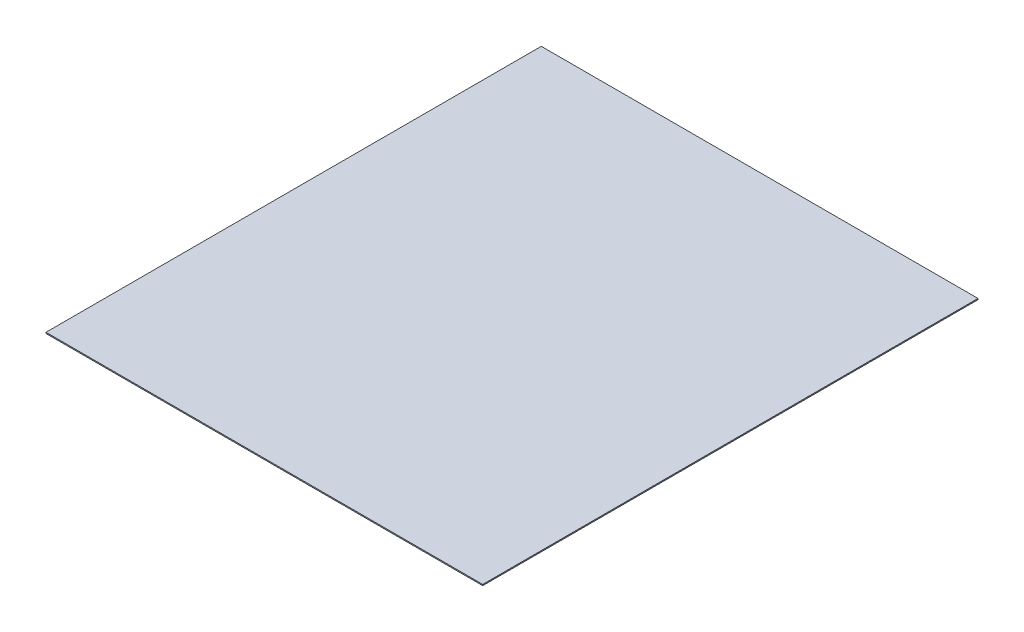
ISO-10303-21;
HEADER;
FILE_DESCRIPTION(('STEP AP214'),'2;1');
FILE_NAME('part.step','',(''),(''),'','','');
FILE_SCHEMA(('AUTOMOTIVE_DESIGN { 1 0 10303 214 1 1 1 1 }'));
ENDSEC;
DATA;
#1=APPLICATION_CONTEXT('core data for automotive mechanical design processes');
#2=APPLICATION_PROTOCOL_DEFINITION('international standard','automotive_design',2000,#1);
#3=PRODUCT_CONTEXT('',#1,'mechanical');
#4=PRODUCT('Part','Part','',(#3));
#5=PRODUCT_RELATED_PRODUCT_CATEGORY('part','',(#4));
#6=PRODUCT_DEFINITION_FORMATION('','',#4);
#7=PRODUCT_DEFINITION_CONTEXT('part definition',#1,'design');
#8=PRODUCT_DEFINITION('design','',#6,#7);
#9=PRODUCT_DEFINITION_SHAPE('','',#8);
#10=(LENGTH_UNIT() NAMED_UNIT(*) SI_UNIT(.MILLI.,.METRE.));
#11=(NAMED_UNIT(*) PLANE_ANGLE_UNIT() SI_UNIT($,.RADIAN.));
#12=(NAMED_UNIT(*) SI_UNIT($,.STERADIAN.) SOLID_ANGLE_UNIT());
#13=UNCERTAINTY_MEASURE_WITH_UNIT(LENGTH_MEASURE(1.E-05),#10,'distance_accuracy_value','');
#14=(GEOMETRIC_REPRESENTATION_CONTEXT(3) GLOBAL_UNCERTAINTY_ASSIGNED_CONTEXT((#13)) GLOBAL_UNIT_ASSIGNED_CONTEXT((#10,
#11,#12)) REPRESENTATION_CONTEXT('',''));
#15=CARTESIAN_POINT('',(0.,0.,0.));
#16=DIRECTION('',(0.,0.,1.));
#17=DIRECTION('',(1.,0.,0.));
#18=AXIS2_PLACEMENT_3D('',#15,#16,#17);
#19=CARTESIAN_POINT('',(16.7,5.,-666.));
#20=DIRECTION('',(-1.,0.,0.));
#21=DIRECTION('',(0.,0.,1.));
#22=AXIS2_PLACEMENT_3D('',#19,#20,#21);
#23=PLANE('',#22);
#24=DIRECTION('',(0.,-1.,0.));
#25=VECTOR('',#24,1.);
#26=CARTESIAN_POINT('',(16.7,5.,-3.));
#27=LINE('',#26,#25);
#28=CARTESIAN_POINT('',(16.7,6.5,-3.));
#29=VERTEX_POINT('',#28);
#30=CARTESIAN_POINT('',(16.7,5.,-3.));
#31=VERTEX_POINT('',#30);
#32=EDGE_CURVE('E103',#29,#31,#27,.T.);
#33=ORIENTED_EDGE('',*,*,#32,.F.);
#34=DIRECTION('',(0.,0.,1.));
#35=VECTOR('',#34,1.);
#36=CARTESIAN_POINT('',(16.7,6.5,-666.));
#37=LINE('',#36,#35);
#38=CARTESIAN_POINT('',(16.7,6.5,-666.));
#39=VERTEX_POINT('',#38);
#40=EDGE_CURVE('E11',#39,#29,#37,.T.);
#41=ORIENTED_EDGE('',*,*,#40,.F.);
#42=DIRECTION('',(0.,-1.,0.));
#43=VECTOR('',#42,1.);
#44=CARTESIAN_POINT('',(16.7,5.,-666.));
#45=LINE('',#44,#43);
#46=CARTESIAN_POINT('',(16.7,5.,-666.));
#47=VERTEX_POINT('',#46);
#48=EDGE_CURVE('E97',#39,#47,#45,.T.);
#49=ORIENTED_EDGE('',*,*,#48,.T.);
#50=DIRECTION('',(0.,0.,1.));
#51=VECTOR('',#50,1.);
#52=CARTESIAN_POINT('',(16.7,5.,-666.));
#53=LINE('',#52,#51);
#54=EDGE_CURVE('E42',#47,#31,#53,.T.);
#55=ORIENTED_EDGE('',*,*,#54,.T.);
#56=EDGE_LOOP('',(#33,#41,#49,#55));
#57=FACE_BOUND('',#56,.T.);
#58=ADVANCED_FACE('F39',(#57),#23,.T.);
#59=CARTESIAN_POINT('',(16.7,6.5,-666.));
#60=DIRECTION('',(0.,1.,0.));
#61=DIRECTION('',(0.,0.,1.));
#62=AXIS2_PLACEMENT_3D('',#59,#60,#61);
#63=PLANE('',#62);
#64=DIRECTION('',(-1.,0.,0.));
#65=VECTOR('',#64,1.);
#66=CARTESIAN_POINT('',(16.7,6.5,-3.));
#67=LINE('',#66,#65);
#68=CARTESIAN_POINT('',(601.3,6.5,-3.));
#69=VERTEX_POINT('',#68);
#70=EDGE_CURVE('E99',#69,#29,#67,.T.);
#71=ORIENTED_EDGE('',*,*,#70,.F.);
#72=DIRECTION('',(0.,0.,1.));
#73=VECTOR('',#72,1.);
#74=CARTESIAN_POINT('',(601.3,6.5,-666.));
#75=LINE('',#74,#73);
#76=CARTESIAN_POINT('',(601.3,6.5,-666.));
#77=VERTEX_POINT('',#76);
#78=EDGE_CURVE('E48',#77,#69,#75,.T.);
#79=ORIENTED_EDGE('',*,*,#78,.F.);
#80=DIRECTION('',(-1.,0.,0.));
#81=VECTOR('',#80,1.);
#82=CARTESIAN_POINT('',(16.7,6.5,-666.));
#83=LINE('',#82,#81);
#84=EDGE_CURVE('E94',#77,#39,#83,.T.);
#85=ORIENTED_EDGE('',*,*,#84,.T.);
#86=ORIENTED_EDGE('',*,*,#40,.T.);
#87=EDGE_LOOP('',(#71,#79,#85,#86));
#88=FACE_BOUND('',#87,.T.);
#89=ADVANCED_FACE('F113',(#88),#63,.T.);
#90=CARTESIAN_POINT('',(601.3,5.,-666.));
#91=DIRECTION('',(1.,0.,0.));
#92=DIRECTION('',(0.,0.,-1.));
#93=AXIS2_PLACEMENT_3D('',#90,#91,#92);
#94=PLANE('',#93);
#95=DIRECTION('',(0.,1.,0.));
#96=VECTOR('',#95,1.);
#97=CARTESIAN_POINT('',(601.3,5.,-3.));
#98=LINE('',#97,#96);
#99=CARTESIAN_POINT('',(601.3,5.,-3.));
#100=VERTEX_POINT('',#99);
#101=EDGE_CURVE('E89',#100,#69,#98,.T.);
#102=ORIENTED_EDGE('',*,*,#101,.F.);
#103=DIRECTION('',(0.,0.,1.));
#104=VECTOR('',#103,1.);
#105=CARTESIAN_POINT('',(601.3,5.,-666.));
#106=LINE('',#105,#104);
#107=CARTESIAN_POINT('',(601.3,5.,-666.));
#108=VERTEX_POINT('',#107);
#109=EDGE_CURVE('E84',#108,#100,#106,.T.);
#110=ORIENTED_EDGE('',*,*,#109,.F.);
#111=DIRECTION('',(0.,1.,0.));
#112=VECTOR('',#111,1.);
#113=CARTESIAN_POINT('',(601.3,5.,-666.));
#114=LINE('',#113,#112);
#115=EDGE_CURVE('E87',#108,#77,#114,.T.);
#116=ORIENTED_EDGE('',*,*,#115,.T.);
#117=ORIENTED_EDGE('',*,*,#78,.T.);
#118=EDGE_LOOP('',(#102,#110,#116,#117));
#119=FACE_BOUND('',#118,.T.);
#120=ADVANCED_FACE('F86',(#119),#94,.T.);
#121=CARTESIAN_POINT('',(16.7,5.,-666.));
#122=DIRECTION('',(0.,-1.,0.));
#123=DIRECTION('',(0.,0.,-1.));
#124=AXIS2_PLACEMENT_3D('',#121,#122,#123);
#125=PLANE('',#124);
#126=DIRECTION('',(1.,0.,0.));
#127=VECTOR('',#126,1.);
#128=CARTESIAN_POINT('',(16.7,5.,-3.));
#129=LINE('',#128,#127);
#130=EDGE_CURVE('E106',#31,#100,#129,.T.);
#131=ORIENTED_EDGE('',*,*,#130,.F.);
#132=ORIENTED_EDGE('',*,*,#54,.F.);
#133=DIRECTION('',(1.,0.,0.));
#134=VECTOR('',#133,1.);
#135=CARTESIAN_POINT('',(16.7,5.,-666.));
#136=LINE('',#135,#134);
#137=EDGE_CURVE('E93',#47,#108,#136,.T.);
#138=ORIENTED_EDGE('',*,*,#137,.T.);
#139=ORIENTED_EDGE('',*,*,#109,.T.);
#140=EDGE_LOOP('',(#131,#132,#138,#139));
#141=FACE_BOUND('',#140,.T.);
#142=ADVANCED_FACE('F96',(#141),#125,.T.);
#143=CARTESIAN_POINT('',(0.,0.,-666.));
#144=DIRECTION('',(0.,0.,-1.));
#145=DIRECTION('',(-1.,0.,0.));
#146=AXIS2_PLACEMENT_3D('',#143,#144,#145);
#147=PLANE('',#146);
#148=ORIENTED_EDGE('',*,*,#48,.F.);
#149=ORIENTED_EDGE('',*,*,#84,.F.);
#150=ORIENTED_EDGE('',*,*,#115,.F.);
#151=ORIENTED_EDGE('',*,*,#137,.F.);
#152=EDGE_LOOP('',(#148,#149,#150,#151));
#153=FACE_BOUND('',#152,.T.);
#154=ADVANCED_FACE('F92',(#153),#147,.T.);
#155=CARTESIAN_POINT('',(0.,0.,-3.));
#156=DIRECTION('',(0.,0.,-1.));
#157=DIRECTION('',(-1.,0.,0.));
#158=AXIS2_PLACEMENT_3D('',#155,#156,#157);
#159=PLANE('',#158);
#160=ORIENTED_EDGE('',*,*,#32,.T.);
#161=ORIENTED_EDGE('',*,*,#130,.T.);
#162=ORIENTED_EDGE('',*,*,#101,.T.);
#163=ORIENTED_EDGE('',*,*,#70,.T.);
#164=EDGE_LOOP('',(#160,#161,#162,#163));
#165=FACE_BOUND('',#164,.T.);
#166=ADVANCED_FACE('F112',(#165),#159,.F.);
#167=CLOSED_SHELL('',(#58,#89,#120,#142,#154,#166));
#168=MANIFOLD_SOLID_BREP('B2',#167);
#169=ADVANCED_BREP_SHAPE_REPRESENTATION('',(#18,#168),#14);
#170=SHAPE_DEFINITION_REPRESENTATION(#9,#169);
ENDSEC;
END-ISO-10303-21;
